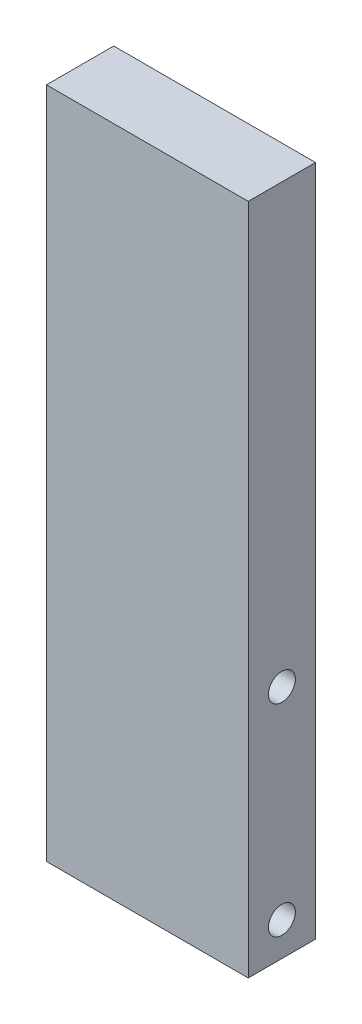
ISO-10303-21;
HEADER;
FILE_DESCRIPTION(('STEP AP214'),'2;1');
FILE_NAME('part.step','',(''),(''),'','','');
FILE_SCHEMA(('AUTOMOTIVE_DESIGN { 1 0 10303 214 1 1 1 1 }'));
ENDSEC;
DATA;
#1=APPLICATION_CONTEXT('core data for automotive mechanical design processes');
#2=APPLICATION_PROTOCOL_DEFINITION('international standard','automotive_design',2000,#1);
#3=PRODUCT_CONTEXT('',#1,'mechanical');
#4=PRODUCT('Part','Part','',(#3));
#5=PRODUCT_RELATED_PRODUCT_CATEGORY('part','',(#4));
#6=PRODUCT_DEFINITION_FORMATION('','',#4);
#7=PRODUCT_DEFINITION_CONTEXT('part definition',#1,'design');
#8=PRODUCT_DEFINITION('design','',#6,#7);
#9=PRODUCT_DEFINITION_SHAPE('','',#8);
#10=(LENGTH_UNIT() NAMED_UNIT(*) SI_UNIT(.MILLI.,.METRE.));
#11=(NAMED_UNIT(*) PLANE_ANGLE_UNIT() SI_UNIT($,.RADIAN.));
#12=(NAMED_UNIT(*) SI_UNIT($,.STERADIAN.) SOLID_ANGLE_UNIT());
#13=UNCERTAINTY_MEASURE_WITH_UNIT(LENGTH_MEASURE(1.E-05),#10,'distance_accuracy_value','');
#14=(GEOMETRIC_REPRESENTATION_CONTEXT(3) GLOBAL_UNCERTAINTY_ASSIGNED_CONTEXT((#13)) GLOBAL_UNIT_ASSIGNED_CONTEXT((#10,
#11,#12)) REPRESENTATION_CONTEXT('',''));
#15=CARTESIAN_POINT('',(0.,0.,0.));
#16=DIRECTION('',(0.,0.,1.));
#17=DIRECTION('',(1.,0.,0.));
#18=AXIS2_PLACEMENT_3D('',#15,#16,#17);
#19=CARTESIAN_POINT('',(0.,0.,10.));
#20=DIRECTION('',(1.,0.,0.));
#21=DIRECTION('',(0.,0.,-1.));
#22=AXIS2_PLACEMENT_3D('',#19,#20,#21);
#23=PLANE('',#22);
#24=CARTESIAN_POINT('',(0.,35.,5.));
#25=DIRECTION('',(1.,0.,0.));
#26=DIRECTION('',(0.,0.,-1.));
#27=AXIS2_PLACEMENT_3D('',#24,#25,#26);
#28=CIRCLE('',#27,2.);
#29=CARTESIAN_POINT('',(0.,35.,3.));
#30=VERTEX_POINT('',#29);
#31=EDGE_CURVE('E113',#30,#30,#28,.T.);
#32=ORIENTED_EDGE('',*,*,#31,.T.);
#33=EDGE_LOOP('',(#32));
#34=FACE_BOUND('',#33,.T.);
#35=CARTESIAN_POINT('',(0.,5.,5.));
#36=DIRECTION('',(1.,0.,0.));
#37=DIRECTION('',(0.,0.,-1.));
#38=AXIS2_PLACEMENT_3D('',#35,#36,#37);
#39=CIRCLE('',#38,2.);
#40=CARTESIAN_POINT('',(0.,5.,3.));
#41=VERTEX_POINT('',#40);
#42=EDGE_CURVE('E99',#41,#41,#39,.T.);
#43=ORIENTED_EDGE('',*,*,#42,.T.);
#44=EDGE_LOOP('',(#43));
#45=FACE_BOUND('',#44,.T.);
#46=DIRECTION('',(0.,-1.,0.));
#47=VECTOR('',#46,1.);
#48=CARTESIAN_POINT('',(0.,0.,0.));
#49=LINE('',#48,#47);
#50=CARTESIAN_POINT('',(0.,100.,0.));
#51=VERTEX_POINT('',#50);
#52=CARTESIAN_POINT('',(0.,0.,0.));
#53=VERTEX_POINT('',#52);
#54=EDGE_CURVE('E96',#51,#53,#49,.T.);
#55=ORIENTED_EDGE('',*,*,#54,.T.);
#56=DIRECTION('',(0.,0.,-1.));
#57=VECTOR('',#56,1.);
#58=CARTESIAN_POINT('',(0.,0.,10.));
#59=LINE('',#58,#57);
#60=CARTESIAN_POINT('',(0.,0.,10.));
#61=VERTEX_POINT('',#60);
#62=EDGE_CURVE('E11',#61,#53,#59,.T.);
#63=ORIENTED_EDGE('',*,*,#62,.F.);
#64=DIRECTION('',(0.,-1.,0.));
#65=VECTOR('',#64,1.);
#66=CARTESIAN_POINT('',(0.,0.,10.));
#67=LINE('',#66,#65);
#68=CARTESIAN_POINT('',(0.,100.,10.));
#69=VERTEX_POINT('',#68);
#70=EDGE_CURVE('E84',#69,#61,#67,.T.);
#71=ORIENTED_EDGE('',*,*,#70,.F.);
#72=DIRECTION('',(0.,0.,-1.));
#73=VECTOR('',#72,1.);
#74=CARTESIAN_POINT('',(0.,100.,10.));
#75=LINE('',#74,#73);
#76=EDGE_CURVE('E92',#69,#51,#75,.T.);
#77=ORIENTED_EDGE('',*,*,#76,.T.);
#78=EDGE_LOOP('',(#55,#63,#71,#77));
#79=FACE_BOUND('',#78,.T.);
#80=ADVANCED_FACE('F33',(#34,#45,#79),#23,.F.);
#81=CARTESIAN_POINT('',(0.,0.,10.));
#82=DIRECTION('',(0.,1.,0.));
#83=DIRECTION('',(0.,0.,1.));
#84=AXIS2_PLACEMENT_3D('',#81,#82,#83);
#85=PLANE('',#84);
#86=DIRECTION('',(1.,0.,0.));
#87=VECTOR('',#86,1.);
#88=CARTESIAN_POINT('',(0.,0.,0.));
#89=LINE('',#88,#87);
#90=CARTESIAN_POINT('',(30.,0.,0.));
#91=VERTEX_POINT('',#90);
#92=EDGE_CURVE('E88',#53,#91,#89,.T.);
#93=ORIENTED_EDGE('',*,*,#92,.T.);
#94=DIRECTION('',(0.,0.,-1.));
#95=VECTOR('',#94,1.);
#96=CARTESIAN_POINT('',(30.,0.,10.));
#97=LINE('',#96,#95);
#98=CARTESIAN_POINT('',(30.,0.,10.));
#99=VERTEX_POINT('',#98);
#100=EDGE_CURVE('E41',#99,#91,#97,.T.);
#101=ORIENTED_EDGE('',*,*,#100,.F.);
#102=DIRECTION('',(1.,0.,0.));
#103=VECTOR('',#102,1.);
#104=CARTESIAN_POINT('',(0.,0.,10.));
#105=LINE('',#104,#103);
#106=EDGE_CURVE('E79',#61,#99,#105,.T.);
#107=ORIENTED_EDGE('',*,*,#106,.F.);
#108=ORIENTED_EDGE('',*,*,#62,.T.);
#109=EDGE_LOOP('',(#93,#101,#107,#108));
#110=FACE_BOUND('',#109,.T.);
#111=ADVANCED_FACE('F87',(#110),#85,.F.);
#112=CARTESIAN_POINT('',(30.,0.,10.));
#113=DIRECTION('',(-1.,0.,0.));
#114=DIRECTION('',(0.,0.,1.));
#115=AXIS2_PLACEMENT_3D('',#112,#113,#114);
#116=PLANE('',#115);
#117=CARTESIAN_POINT('',(30.,35.,5.));
#118=DIRECTION('',(1.,0.,0.));
#119=DIRECTION('',(0.,0.,-1.));
#120=AXIS2_PLACEMENT_3D('',#117,#118,#119);
#121=CIRCLE('',#120,2.);
#122=CARTESIAN_POINT('',(30.,35.,3.));
#123=VERTEX_POINT('',#122);
#124=EDGE_CURVE('E116',#123,#123,#121,.T.);
#125=ORIENTED_EDGE('',*,*,#124,.F.);
#126=EDGE_LOOP('',(#125));
#127=FACE_BOUND('',#126,.T.);
#128=CARTESIAN_POINT('',(30.,5.,5.));
#129=DIRECTION('',(1.,0.,0.));
#130=DIRECTION('',(0.,0.,-1.));
#131=AXIS2_PLACEMENT_3D('',#128,#129,#130);
#132=CIRCLE('',#131,2.);
#133=CARTESIAN_POINT('',(30.,5.,3.));
#134=VERTEX_POINT('',#133);
#135=EDGE_CURVE('E110',#134,#134,#132,.T.);
#136=ORIENTED_EDGE('',*,*,#135,.F.);
#137=EDGE_LOOP('',(#136));
#138=FACE_BOUND('',#137,.T.);
#139=DIRECTION('',(0.,1.,0.));
#140=VECTOR('',#139,1.);
#141=CARTESIAN_POINT('',(30.,0.,0.));
#142=LINE('',#141,#140);
#143=CARTESIAN_POINT('',(30.,100.,0.));
#144=VERTEX_POINT('',#143);
#145=EDGE_CURVE('E66',#91,#144,#142,.T.);
#146=ORIENTED_EDGE('',*,*,#145,.T.);
#147=DIRECTION('',(0.,0.,-1.));
#148=VECTOR('',#147,1.);
#149=CARTESIAN_POINT('',(30.,100.,10.));
#150=LINE('',#149,#148);
#151=CARTESIAN_POINT('',(30.,100.,10.));
#152=VERTEX_POINT('',#151);
#153=EDGE_CURVE('E89',#152,#144,#150,.T.);
#154=ORIENTED_EDGE('',*,*,#153,.F.);
#155=DIRECTION('',(0.,1.,0.));
#156=VECTOR('',#155,1.);
#157=CARTESIAN_POINT('',(30.,0.,10.));
#158=LINE('',#157,#156);
#159=EDGE_CURVE('E82',#99,#152,#158,.T.);
#160=ORIENTED_EDGE('',*,*,#159,.F.);
#161=ORIENTED_EDGE('',*,*,#100,.T.);
#162=EDGE_LOOP('',(#146,#154,#160,#161));
#163=FACE_BOUND('',#162,.T.);
#164=ADVANCED_FACE('F90',(#127,#138,#163),#116,.F.);
#165=CARTESIAN_POINT('',(0.,100.,10.));
#166=DIRECTION('',(0.,-1.,0.));
#167=DIRECTION('',(0.,0.,-1.));
#168=AXIS2_PLACEMENT_3D('',#165,#166,#167);
#169=PLANE('',#168);
#170=DIRECTION('',(-1.,0.,0.));
#171=VECTOR('',#170,1.);
#172=CARTESIAN_POINT('',(0.,100.,0.));
#173=LINE('',#172,#171);
#174=EDGE_CURVE('E72',#144,#51,#173,.T.);
#175=ORIENTED_EDGE('',*,*,#174,.T.);
#176=ORIENTED_EDGE('',*,*,#76,.F.);
#177=DIRECTION('',(-1.,0.,0.));
#178=VECTOR('',#177,1.);
#179=CARTESIAN_POINT('',(0.,100.,10.));
#180=LINE('',#179,#178);
#181=EDGE_CURVE('E49',#152,#69,#180,.T.);
#182=ORIENTED_EDGE('',*,*,#181,.F.);
#183=ORIENTED_EDGE('',*,*,#153,.T.);
#184=EDGE_LOOP('',(#175,#176,#182,#183));
#185=FACE_BOUND('',#184,.T.);
#186=ADVANCED_FACE('F104',(#185),#169,.F.);
#187=CARTESIAN_POINT('',(0.,100.,10.));
#188=DIRECTION('',(0.,0.,-1.));
#189=DIRECTION('',(-1.,0.,0.));
#190=AXIS2_PLACEMENT_3D('',#187,#188,#189);
#191=PLANE('',#190);
#192=ORIENTED_EDGE('',*,*,#70,.T.);
#193=ORIENTED_EDGE('',*,*,#106,.T.);
#194=ORIENTED_EDGE('',*,*,#159,.T.);
#195=ORIENTED_EDGE('',*,*,#181,.T.);
#196=EDGE_LOOP('',(#192,#193,#194,#195));
#197=FACE_BOUND('',#196,.T.);
#198=ADVANCED_FACE('F80',(#197),#191,.F.);
#199=CARTESIAN_POINT('',(0.,100.,0.));
#200=DIRECTION('',(0.,0.,-1.));
#201=DIRECTION('',(-1.,0.,0.));
#202=AXIS2_PLACEMENT_3D('',#199,#200,#201);
#203=PLANE('',#202);
#204=ORIENTED_EDGE('',*,*,#54,.F.);
#205=ORIENTED_EDGE('',*,*,#174,.F.);
#206=ORIENTED_EDGE('',*,*,#145,.F.);
#207=ORIENTED_EDGE('',*,*,#92,.F.);
#208=EDGE_LOOP('',(#204,#205,#206,#207));
#209=FACE_BOUND('',#208,.T.);
#210=ADVANCED_FACE('F107',(#209),#203,.T.);
#211=CARTESIAN_POINT('',(0.,5.,5.));
#212=DIRECTION('',(1.,0.,0.));
#213=DIRECTION('',(0.,0.,-1.));
#214=AXIS2_PLACEMENT_3D('',#211,#212,#213);
#215=CYLINDRICAL_SURFACE('',#214,2.);
#216=ORIENTED_EDGE('',*,*,#42,.F.);
#217=EDGE_LOOP('',(#216));
#218=FACE_BOUND('',#217,.T.);
#219=ORIENTED_EDGE('',*,*,#135,.T.);
#220=EDGE_LOOP('',(#219));
#221=FACE_BOUND('',#220,.T.);
#222=ADVANCED_FACE('F127',(#218,#221),#215,.F.);
#223=CARTESIAN_POINT('',(0.,35.,5.));
#224=DIRECTION('',(1.,0.,0.));
#225=DIRECTION('',(0.,0.,-1.));
#226=AXIS2_PLACEMENT_3D('',#223,#224,#225);
#227=CYLINDRICAL_SURFACE('',#226,2.);
#228=ORIENTED_EDGE('',*,*,#31,.F.);
#229=EDGE_LOOP('',(#228));
#230=FACE_BOUND('',#229,.T.);
#231=ORIENTED_EDGE('',*,*,#124,.T.);
#232=EDGE_LOOP('',(#231));
#233=FACE_BOUND('',#232,.T.);
#234=ADVANCED_FACE('F124',(#230,#233),#227,.F.);
#235=CLOSED_SHELL('',(#80,#111,#164,#186,#198,#210,#222,#234));
#236=MANIFOLD_SOLID_BREP('B2',#235);
#237=ADVANCED_BREP_SHAPE_REPRESENTATION('',(#18,#236),#14);
#238=SHAPE_DEFINITION_REPRESENTATION(#9,#237);
ENDSEC;
END-ISO-10303-21;
